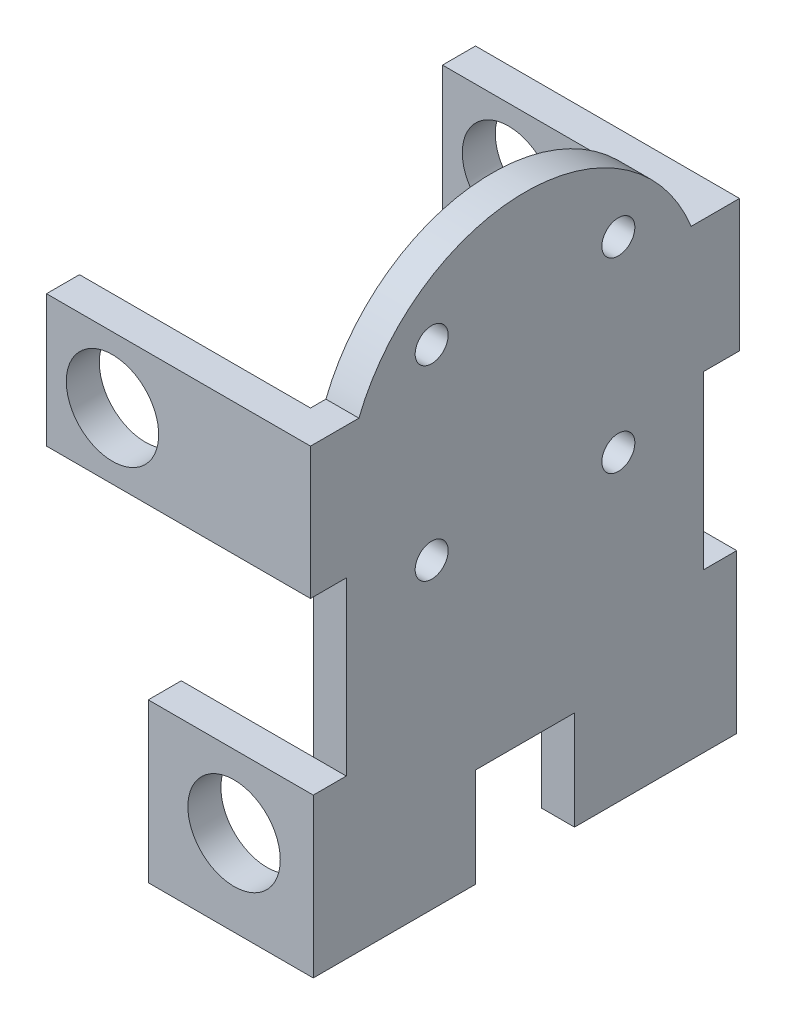
ISO-10303-21;
HEADER;
FILE_DESCRIPTION(('STEP AP214'),'2;1');
FILE_NAME('part.step','',(''),(''),'','','');
FILE_SCHEMA(('AUTOMOTIVE_DESIGN { 1 0 10303 214 1 1 1 1 }'));
ENDSEC;
DATA;
#1=APPLICATION_CONTEXT('core data for automotive mechanical design processes');
#2=APPLICATION_PROTOCOL_DEFINITION('international standard','automotive_design',2000,#1);
#3=PRODUCT_CONTEXT('',#1,'mechanical');
#4=PRODUCT('Part','Part','',(#3));
#5=PRODUCT_RELATED_PRODUCT_CATEGORY('part','',(#4));
#6=PRODUCT_DEFINITION_FORMATION('','',#4);
#7=PRODUCT_DEFINITION_CONTEXT('part definition',#1,'design');
#8=PRODUCT_DEFINITION('design','',#6,#7);
#9=PRODUCT_DEFINITION_SHAPE('','',#8);
#10=(LENGTH_UNIT() NAMED_UNIT(*) SI_UNIT(.MILLI.,.METRE.));
#11=(NAMED_UNIT(*) PLANE_ANGLE_UNIT() SI_UNIT($,.RADIAN.));
#12=(NAMED_UNIT(*) SI_UNIT($,.STERADIAN.) SOLID_ANGLE_UNIT());
#13=UNCERTAINTY_MEASURE_WITH_UNIT(LENGTH_MEASURE(1.E-05),#10,'distance_accuracy_value','');
#14=(GEOMETRIC_REPRESENTATION_CONTEXT(3) GLOBAL_UNCERTAINTY_ASSIGNED_CONTEXT((#13)) GLOBAL_UNIT_ASSIGNED_CONTEXT((#10,
#11,#12)) REPRESENTATION_CONTEXT('',''));
#15=CARTESIAN_POINT('',(0.,0.,0.));
#16=DIRECTION('',(0.,0.,1.));
#17=DIRECTION('',(1.,0.,0.));
#18=AXIS2_PLACEMENT_3D('',#15,#16,#17);
#19=CARTESIAN_POINT('',(-2.5,0.,27.08));
#20=DIRECTION('',(0.,0.,1.));
#21=DIRECTION('',(0.,-1.,0.));
#22=AXIS2_PLACEMENT_3D('',#19,#20,#21);
#23=PLANE('',#22);
#24=DIRECTION('',(0.,-1.,0.));
#25=VECTOR('',#24,1.);
#26=CARTESIAN_POINT('',(-2.5,0.,27.08));
#27=LINE('',#26,#25);
#28=CARTESIAN_POINT('',(-2.5,-10.,27.08));
#29=VERTEX_POINT('',#28);
#30=CARTESIAN_POINT('',(-2.5,-36.,27.08));
#31=VERTEX_POINT('',#30);
#32=EDGE_CURVE('E518',#29,#31,#27,.T.);
#33=ORIENTED_EDGE('',*,*,#32,.T.);
#34=DIRECTION('',(-1.,0.,0.));
#35=VECTOR('',#34,1.);
#36=CARTESIAN_POINT('',(2.5,-36.,27.08));
#37=LINE('',#36,#35);
#38=CARTESIAN_POINT('',(2.5,-36.,27.08));
#39=VERTEX_POINT('',#38);
#40=EDGE_CURVE('E298',#39,#31,#37,.T.);
#41=ORIENTED_EDGE('',*,*,#40,.F.);
#42=DIRECTION('',(0.,-1.,0.));
#43=VECTOR('',#42,1.);
#44=CARTESIAN_POINT('',(2.5,0.,27.08));
#45=LINE('',#44,#43);
#46=CARTESIAN_POINT('',(2.5,-10.,27.08));
#47=VERTEX_POINT('',#46);
#48=EDGE_CURVE('E235',#47,#39,#45,.T.);
#49=ORIENTED_EDGE('',*,*,#48,.F.);
#50=DIRECTION('',(1.,0.,0.));
#51=VECTOR('',#50,1.);
#52=CARTESIAN_POINT('',(-2.5,-10.,27.08));
#53=LINE('',#52,#51);
#54=EDGE_CURVE('E448',#29,#47,#53,.T.);
#55=ORIENTED_EDGE('',*,*,#54,.F.);
#56=EDGE_LOOP('',(#33,#41,#49,#55));
#57=FACE_BOUND('',#56,.T.);
#58=ADVANCED_FACE('F45',(#57),#23,.T.);
#59=CARTESIAN_POINT('',(-2.5,-60.,27.08));
#60=DIRECTION('',(0.,-1.,0.));
#61=DIRECTION('',(0.,0.,-1.));
#62=AXIS2_PLACEMENT_3D('',#59,#60,#61);
#63=PLANE('',#62);
#64=DIRECTION('',(-1.,0.,0.));
#65=VECTOR('',#64,1.);
#66=CARTESIAN_POINT('',(2.5,-60.,7.5));
#67=LINE('',#66,#65);
#68=CARTESIAN_POINT('',(2.5,-60.,7.5));
#69=VERTEX_POINT('',#68);
#70=CARTESIAN_POINT('',(-2.5,-60.,7.5));
#71=VERTEX_POINT('',#70);
#72=EDGE_CURVE('E343',#69,#71,#67,.T.);
#73=ORIENTED_EDGE('',*,*,#72,.F.);
#74=DIRECTION('',(0.,0.,-1.));
#75=VECTOR('',#74,1.);
#76=CARTESIAN_POINT('',(2.5,-60.,27.08));
#77=LINE('',#76,#75);
#78=CARTESIAN_POINT('',(2.5,-60.,32.08));
#79=VERTEX_POINT('',#78);
#80=EDGE_CURVE('E234',#79,#69,#77,.T.);
#81=ORIENTED_EDGE('',*,*,#80,.F.);
#82=DIRECTION('',(1.,0.,0.));
#83=VECTOR('',#82,1.);
#84=CARTESIAN_POINT('',(2.5,-60.,32.08));
#85=LINE('',#84,#83);
#86=CARTESIAN_POINT('',(-22.5,-60.,32.08));
#87=VERTEX_POINT('',#86);
#88=EDGE_CURVE('E293',#87,#79,#85,.T.);
#89=ORIENTED_EDGE('',*,*,#88,.F.);
#90=DIRECTION('',(0.,0.,-1.));
#91=VECTOR('',#90,1.);
#92=CARTESIAN_POINT('',(-22.5,-60.,32.08));
#93=LINE('',#92,#91);
#94=CARTESIAN_POINT('',(-22.5,-60.,27.08));
#95=VERTEX_POINT('',#94);
#96=EDGE_CURVE('E297',#87,#95,#93,.T.);
#97=ORIENTED_EDGE('',*,*,#96,.T.);
#98=DIRECTION('',(1.,0.,0.));
#99=VECTOR('',#98,1.);
#100=CARTESIAN_POINT('',(2.5,-60.,27.08));
#101=LINE('',#100,#99);
#102=CARTESIAN_POINT('',(-2.5,-60.,27.08));
#103=VERTEX_POINT('',#102);
#104=EDGE_CURVE('E287',#95,#103,#101,.T.);
#105=ORIENTED_EDGE('',*,*,#104,.T.);
#106=DIRECTION('',(0.,0.,-1.));
#107=VECTOR('',#106,1.);
#108=CARTESIAN_POINT('',(-2.5,-60.,27.08));
#109=LINE('',#108,#107);
#110=EDGE_CURVE('E523',#103,#71,#109,.T.);
#111=ORIENTED_EDGE('',*,*,#110,.T.);
#112=EDGE_LOOP('',(#73,#81,#89,#97,#105,#111));
#113=FACE_BOUND('',#112,.T.);
#114=ADVANCED_FACE('F551',(#113),#63,.T.);
#115=CARTESIAN_POINT('',(-2.5,0.,0.));
#116=DIRECTION('',(-1.,0.,0.));
#117=DIRECTION('',(0.,0.,1.));
#118=AXIS2_PLACEMENT_3D('',#115,#116,#117);
#119=PLANE('',#118);
#120=DIRECTION('',(0.,0.,-1.));
#121=VECTOR('',#120,1.);
#122=CARTESIAN_POINT('',(-2.5,-45.,7.5));
#123=LINE('',#122,#121);
#124=CARTESIAN_POINT('',(-2.5,-45.,7.5));
#125=VERTEX_POINT('',#124);
#126=CARTESIAN_POINT('',(-2.5,-45.,-7.5));
#127=VERTEX_POINT('',#126);
#128=EDGE_CURVE('E337',#125,#127,#123,.T.);
#129=ORIENTED_EDGE('',*,*,#128,.F.);
#130=DIRECTION('',(0.,1.,0.));
#131=VECTOR('',#130,1.);
#132=CARTESIAN_POINT('',(-2.5,-60.,7.5));
#133=LINE('',#132,#131);
#134=EDGE_CURVE('E323',#71,#125,#133,.T.);
#135=ORIENTED_EDGE('',*,*,#134,.F.);
#136=ORIENTED_EDGE('',*,*,#110,.F.);
#137=DIRECTION('',(0.,1.,0.));
#138=VECTOR('',#137,1.);
#139=CARTESIAN_POINT('',(-2.5,0.,27.08));
#140=LINE('',#139,#138);
#141=CARTESIAN_POINT('',(-2.5,-47.,27.08));
#142=VERTEX_POINT('',#141);
#143=EDGE_CURVE('E319',#103,#142,#140,.T.);
#144=ORIENTED_EDGE('',*,*,#143,.T.);
#145=EDGE_CURVE('E318',#142,#31,#140,.T.);
#146=ORIENTED_EDGE('',*,*,#145,.T.);
#147=ORIENTED_EDGE('',*,*,#32,.F.);
#148=DIRECTION('',(0.,0.,-1.));
#149=VECTOR('',#148,1.);
#150=CARTESIAN_POINT('',(-2.5,-10.,32.5));
#151=LINE('',#150,#149);
#152=CARTESIAN_POINT('',(-2.5,-10.,27.5));
#153=VERTEX_POINT('',#152);
#154=EDGE_CURVE('E436',#153,#29,#151,.T.);
#155=ORIENTED_EDGE('',*,*,#154,.F.);
#156=DIRECTION('',(0.,-1.,0.));
#157=VECTOR('',#156,1.);
#158=CARTESIAN_POINT('',(-2.5,10.,27.5));
#159=LINE('',#158,#157);
#160=CARTESIAN_POINT('',(-2.5,10.,27.5));
#161=VERTEX_POINT('',#160);
#162=EDGE_CURVE('E376',#161,#153,#159,.T.);
#163=ORIENTED_EDGE('',*,*,#162,.F.);
#164=DIRECTION('',(0.,0.,1.));
#165=VECTOR('',#164,1.);
#166=CARTESIAN_POINT('',(-2.5,10.,32.5));
#167=LINE('',#166,#165);
#168=CARTESIAN_POINT('',(-2.5,10.,25.1659770324937));
#169=VERTEX_POINT('',#168);
#170=EDGE_CURVE('E439',#169,#161,#167,.T.);
#171=ORIENTED_EDGE('',*,*,#170,.F.);
#172=CARTESIAN_POINT('',(-2.5,0.,0.));
#173=DIRECTION('',(1.,0.,0.));
#174=DIRECTION('',(0.,0.,1.));
#175=AXIS2_PLACEMENT_3D('',#172,#173,#174);
#176=CIRCLE('',#175,27.08);
#177=CARTESIAN_POINT('',(-2.5,10.,-25.1659770324937));
#178=VERTEX_POINT('',#177);
#179=EDGE_CURVE('E514',#178,#169,#176,.T.);
#180=ORIENTED_EDGE('',*,*,#179,.F.);
#181=CARTESIAN_POINT('',(-2.5,10.,-27.5));
#182=VERTEX_POINT('',#181);
#183=EDGE_CURVE('E440',#182,#178,#167,.T.);
#184=ORIENTED_EDGE('',*,*,#183,.F.);
#185=DIRECTION('',(0.,1.,0.));
#186=VECTOR('',#185,1.);
#187=CARTESIAN_POINT('',(-2.5,10.,-27.5));
#188=LINE('',#187,#186);
#189=CARTESIAN_POINT('',(-2.5,-10.,-27.5));
#190=VERTEX_POINT('',#189);
#191=EDGE_CURVE('E379',#190,#182,#188,.T.);
#192=ORIENTED_EDGE('',*,*,#191,.F.);
#193=CARTESIAN_POINT('',(-2.5,-10.,-27.08));
#194=VERTEX_POINT('',#193);
#195=EDGE_CURVE('E435',#194,#190,#151,.T.);
#196=ORIENTED_EDGE('',*,*,#195,.F.);
#197=DIRECTION('',(0.,1.,0.));
#198=VECTOR('',#197,1.);
#199=CARTESIAN_POINT('',(-2.5,0.,-27.08));
#200=LINE('',#199,#198);
#201=CARTESIAN_POINT('',(-2.5,-36.,-27.08));
#202=VERTEX_POINT('',#201);
#203=EDGE_CURVE('E57',#202,#194,#200,.T.);
#204=ORIENTED_EDGE('',*,*,#203,.F.);
#205=CARTESIAN_POINT('',(-2.5,-47.,-27.08));
#206=VERTEX_POINT('',#205);
#207=EDGE_CURVE('E55',#206,#202,#200,.T.);
#208=ORIENTED_EDGE('',*,*,#207,.F.);
#209=CARTESIAN_POINT('',(-2.5,-60.,-27.08));
#210=VERTEX_POINT('',#209);
#211=EDGE_CURVE('E11',#210,#206,#200,.T.);
#212=ORIENTED_EDGE('',*,*,#211,.F.);
#213=CARTESIAN_POINT('',(-2.5,-60.,-7.5));
#214=VERTEX_POINT('',#213);
#215=EDGE_CURVE('E522',#214,#210,#109,.T.);
#216=ORIENTED_EDGE('',*,*,#215,.F.);
#217=DIRECTION('',(0.,-1.,0.));
#218=VECTOR('',#217,1.);
#219=CARTESIAN_POINT('',(-2.5,-60.,-7.5));
#220=LINE('',#219,#218);
#221=EDGE_CURVE('E329',#127,#214,#220,.T.);
#222=ORIENTED_EDGE('',*,*,#221,.F.);
#223=EDGE_LOOP('',(#129,#135,#136,#144,#146,#147,#155,#163,#171,#180,#184,#192,#196,#204,#208,
#212,#216,#222));
#224=FACE_BOUND('',#223,.T.);
#225=CARTESIAN_POINT('',(-2.5,-14.1421356237308,14.1421356237311));
#226=DIRECTION('',(1.,0.,0.));
#227=DIRECTION('',(0.,0.,-1.));
#228=AXIS2_PLACEMENT_3D('',#225,#226,#227);
#229=CIRCLE('',#228,2.5);
#230=CARTESIAN_POINT('',(-2.5,-14.1421356237308,11.6421356237311));
#231=VERTEX_POINT('',#230);
#232=EDGE_CURVE('E471',#231,#231,#229,.T.);
#233=ORIENTED_EDGE('',*,*,#232,.T.);
#234=EDGE_LOOP('',(#233));
#235=FACE_BOUND('',#234,.T.);
#236=CARTESIAN_POINT('',(-2.5,-14.142135623731,-14.1421356237309));
#237=DIRECTION('',(1.,0.,0.));
#238=DIRECTION('',(0.,0.,-1.));
#239=AXIS2_PLACEMENT_3D('',#236,#237,#238);
#240=CIRCLE('',#239,2.5);
#241=CARTESIAN_POINT('',(-2.5,-14.142135623731,-16.6421356237309));
#242=VERTEX_POINT('',#241);
#243=EDGE_CURVE('E485',#242,#242,#240,.T.);
#244=ORIENTED_EDGE('',*,*,#243,.T.);
#245=EDGE_LOOP('',(#244));
#246=FACE_BOUND('',#245,.T.);
#247=CARTESIAN_POINT('',(-2.5,14.1421356237309,14.142135623731));
#248=DIRECTION('',(1.,0.,0.));
#249=DIRECTION('',(0.,0.,-1.));
#250=AXIS2_PLACEMENT_3D('',#247,#248,#249);
#251=CIRCLE('',#250,2.5);
#252=CARTESIAN_POINT('',(-2.5,14.1421356237309,11.642135623731));
#253=VERTEX_POINT('',#252);
#254=EDGE_CURVE('E496',#253,#253,#251,.T.);
#255=ORIENTED_EDGE('',*,*,#254,.T.);
#256=EDGE_LOOP('',(#255));
#257=FACE_BOUND('',#256,.T.);
#258=CARTESIAN_POINT('',(-2.5,14.1421356237309,-14.142135623731));
#259=DIRECTION('',(1.,0.,0.));
#260=DIRECTION('',(0.,0.,-1.));
#261=AXIS2_PLACEMENT_3D('',#258,#259,#260);
#262=CIRCLE('',#261,2.5);
#263=CARTESIAN_POINT('',(-2.5,14.1421356237309,-16.642135623731));
#264=VERTEX_POINT('',#263);
#265=EDGE_CURVE('E477',#264,#264,#262,.T.);
#266=ORIENTED_EDGE('',*,*,#265,.T.);
#267=EDGE_LOOP('',(#266));
#268=FACE_BOUND('',#267,.T.);
#269=ADVANCED_FACE('F556',(#224,#235,#246,#257,#268),#119,.T.);
#270=CARTESIAN_POINT('',(-2.5,0.,0.));
#271=DIRECTION('',(1.,0.,0.));
#272=DIRECTION('',(0.,0.,-1.));
#273=AXIS2_PLACEMENT_3D('',#270,#271,#272);
#274=CYLINDRICAL_SURFACE('',#273,27.08);
#275=DIRECTION('',(1.,0.,0.));
#276=VECTOR('',#275,1.);
#277=CARTESIAN_POINT('',(-2.5,10.,25.1659770324937));
#278=LINE('',#277,#276);
#279=CARTESIAN_POINT('',(2.5,10.,25.1659770324937));
#280=VERTEX_POINT('',#279);
#281=EDGE_CURVE('E468',#280,#169,#278,.F.);
#282=ORIENTED_EDGE('',*,*,#281,.F.);
#283=CARTESIAN_POINT('',(2.5,0.,0.));
#284=DIRECTION('',(1.,0.,0.));
#285=DIRECTION('',(0.,0.,1.));
#286=AXIS2_PLACEMENT_3D('',#283,#284,#285);
#287=CIRCLE('',#286,27.08);
#288=CARTESIAN_POINT('',(2.5,10.,-25.1659770324937));
#289=VERTEX_POINT('',#288);
#290=EDGE_CURVE('E500',#289,#280,#287,.T.);
#291=ORIENTED_EDGE('',*,*,#290,.F.);
#292=DIRECTION('',(1.,0.,0.));
#293=VECTOR('',#292,1.);
#294=CARTESIAN_POINT('',(-2.5,10.,-25.1659770324937));
#295=LINE('',#294,#293);
#296=EDGE_CURVE('E465',#178,#289,#295,.T.);
#297=ORIENTED_EDGE('',*,*,#296,.F.);
#298=ORIENTED_EDGE('',*,*,#179,.T.);
#299=EDGE_LOOP('',(#282,#291,#297,#298));
#300=FACE_BOUND('',#299,.T.);
#301=ADVANCED_FACE('F47',(#300),#274,.T.);
#302=CARTESIAN_POINT('',(-2.5,0.,-27.08));
#303=DIRECTION('',(0.,0.,-1.));
#304=DIRECTION('',(0.,1.,0.));
#305=AXIS2_PLACEMENT_3D('',#302,#303,#304);
#306=PLANE('',#305);
#307=DIRECTION('',(-1.,0.,0.));
#308=VECTOR('',#307,1.);
#309=CARTESIAN_POINT('',(2.5,-36.,-27.08));
#310=LINE('',#309,#308);
#311=CARTESIAN_POINT('',(2.5,-36.,-27.08));
#312=VERTEX_POINT('',#311);
#313=EDGE_CURVE('E246',#312,#202,#310,.T.);
#314=ORIENTED_EDGE('',*,*,#313,.T.);
#315=ORIENTED_EDGE('',*,*,#203,.T.);
#316=DIRECTION('',(-1.,0.,0.));
#317=VECTOR('',#316,1.);
#318=CARTESIAN_POINT('',(-2.5,-10.,-27.08));
#319=LINE('',#318,#317);
#320=CARTESIAN_POINT('',(2.5,-10.,-27.08));
#321=VERTEX_POINT('',#320);
#322=EDGE_CURVE('E461',#321,#194,#319,.T.);
#323=ORIENTED_EDGE('',*,*,#322,.F.);
#324=DIRECTION('',(0.,1.,0.));
#325=VECTOR('',#324,1.);
#326=CARTESIAN_POINT('',(2.5,0.,-27.08));
#327=LINE('',#326,#325);
#328=EDGE_CURVE('E511',#312,#321,#327,.T.);
#329=ORIENTED_EDGE('',*,*,#328,.F.);
#330=EDGE_LOOP('',(#314,#315,#323,#329));
#331=FACE_BOUND('',#330,.T.);
#332=ADVANCED_FACE('F561',(#331),#306,.T.);
#333=DIRECTION('',(-1.,0.,0.));
#334=VECTOR('',#333,1.);
#335=CARTESIAN_POINT('',(2.5,-60.,-7.5));
#336=LINE('',#335,#334);
#337=CARTESIAN_POINT('',(2.5,-60.,-7.5));
#338=VERTEX_POINT('',#337);
#339=EDGE_CURVE('E347',#338,#214,#336,.T.);
#340=ORIENTED_EDGE('',*,*,#339,.T.);
#341=ORIENTED_EDGE('',*,*,#215,.T.);
#342=DIRECTION('',(1.,0.,0.));
#343=VECTOR('',#342,1.);
#344=CARTESIAN_POINT('',(2.5,-60.,-27.08));
#345=LINE('',#344,#343);
#346=CARTESIAN_POINT('',(-22.5,-60.,-27.08));
#347=VERTEX_POINT('',#346);
#348=EDGE_CURVE('E261',#347,#210,#345,.T.);
#349=ORIENTED_EDGE('',*,*,#348,.F.);
#350=DIRECTION('',(0.,0.,1.));
#351=VECTOR('',#350,1.);
#352=CARTESIAN_POINT('',(-22.5,-60.,-32.08));
#353=LINE('',#352,#351);
#354=CARTESIAN_POINT('',(-22.5,-60.,-32.08));
#355=VERTEX_POINT('',#354);
#356=EDGE_CURVE('E250',#355,#347,#353,.T.);
#357=ORIENTED_EDGE('',*,*,#356,.F.);
#358=DIRECTION('',(1.,0.,0.));
#359=VECTOR('',#358,1.);
#360=CARTESIAN_POINT('',(2.5,-60.,-32.08));
#361=LINE('',#360,#359);
#362=CARTESIAN_POINT('',(2.5,-60.,-32.08));
#363=VERTEX_POINT('',#362);
#364=EDGE_CURVE('E241',#355,#363,#361,.T.);
#365=ORIENTED_EDGE('',*,*,#364,.T.);
#366=EDGE_CURVE('E220',#338,#363,#77,.T.);
#367=ORIENTED_EDGE('',*,*,#366,.F.);
#368=EDGE_LOOP('',(#340,#341,#349,#357,#365,#367));
#369=FACE_BOUND('',#368,.T.);
#370=ADVANCED_FACE('F248',(#369),#63,.T.);
#371=CARTESIAN_POINT('',(2.5,0.,0.));
#372=DIRECTION('',(-1.,0.,0.));
#373=DIRECTION('',(0.,0.,1.));
#374=AXIS2_PLACEMENT_3D('',#371,#372,#373);
#375=PLANE('',#374);
#376=ORIENTED_EDGE('',*,*,#80,.T.);
#377=DIRECTION('',(0.,1.,0.));
#378=VECTOR('',#377,1.);
#379=CARTESIAN_POINT('',(2.5,-60.,7.5));
#380=LINE('',#379,#378);
#381=CARTESIAN_POINT('',(2.5,-45.,7.5));
#382=VERTEX_POINT('',#381);
#383=EDGE_CURVE('E324',#69,#382,#380,.T.);
#384=ORIENTED_EDGE('',*,*,#383,.T.);
#385=DIRECTION('',(0.,0.,-1.));
#386=VECTOR('',#385,1.);
#387=CARTESIAN_POINT('',(2.5,-45.,7.5));
#388=LINE('',#387,#386);
#389=CARTESIAN_POINT('',(2.5,-45.,-7.5));
#390=VERTEX_POINT('',#389);
#391=EDGE_CURVE('E328',#382,#390,#388,.T.);
#392=ORIENTED_EDGE('',*,*,#391,.T.);
#393=DIRECTION('',(0.,-1.,0.));
#394=VECTOR('',#393,1.);
#395=CARTESIAN_POINT('',(2.5,-60.,-7.5));
#396=LINE('',#395,#394);
#397=EDGE_CURVE('E229',#390,#338,#396,.T.);
#398=ORIENTED_EDGE('',*,*,#397,.T.);
#399=ORIENTED_EDGE('',*,*,#366,.T.);
#400=DIRECTION('',(0.,1.,0.));
#401=VECTOR('',#400,1.);
#402=CARTESIAN_POINT('',(2.5,-60.,-32.08));
#403=LINE('',#402,#401);
#404=CARTESIAN_POINT('',(2.5,-36.,-32.08));
#405=VERTEX_POINT('',#404);
#406=EDGE_CURVE('E226',#363,#405,#403,.T.);
#407=ORIENTED_EDGE('',*,*,#406,.T.);
#408=DIRECTION('',(0.,0.,1.));
#409=VECTOR('',#408,1.);
#410=CARTESIAN_POINT('',(2.5,-36.,-32.08));
#411=LINE('',#410,#409);
#412=EDGE_CURVE('E260',#405,#312,#411,.T.);
#413=ORIENTED_EDGE('',*,*,#412,.T.);
#414=ORIENTED_EDGE('',*,*,#328,.T.);
#415=DIRECTION('',(0.,0.,-1.));
#416=VECTOR('',#415,1.);
#417=CARTESIAN_POINT('',(2.5,-10.,32.5));
#418=LINE('',#417,#416);
#419=CARTESIAN_POINT('',(2.5,-10.,-32.5));
#420=VERTEX_POINT('',#419);
#421=EDGE_CURVE('E422',#321,#420,#418,.T.);
#422=ORIENTED_EDGE('',*,*,#421,.T.);
#423=DIRECTION('',(0.,1.,0.));
#424=VECTOR('',#423,1.);
#425=CARTESIAN_POINT('',(2.5,10.,-32.5));
#426=LINE('',#425,#424);
#427=CARTESIAN_POINT('',(2.5,10.,-32.5));
#428=VERTEX_POINT('',#427);
#429=EDGE_CURVE('E426',#420,#428,#426,.T.);
#430=ORIENTED_EDGE('',*,*,#429,.T.);
#431=DIRECTION('',(0.,0.,1.));
#432=VECTOR('',#431,1.);
#433=CARTESIAN_POINT('',(2.5,10.,32.5));
#434=LINE('',#433,#432);
#435=EDGE_CURVE('E431',#428,#289,#434,.T.);
#436=ORIENTED_EDGE('',*,*,#435,.T.);
#437=ORIENTED_EDGE('',*,*,#290,.T.);
#438=CARTESIAN_POINT('',(2.5,10.,32.5));
#439=VERTEX_POINT('',#438);
#440=EDGE_CURVE('E430',#280,#439,#434,.T.);
#441=ORIENTED_EDGE('',*,*,#440,.T.);
#442=DIRECTION('',(0.,-1.,0.));
#443=VECTOR('',#442,1.);
#444=CARTESIAN_POINT('',(2.5,10.,32.5));
#445=LINE('',#444,#443);
#446=CARTESIAN_POINT('',(2.5,-10.,32.5));
#447=VERTEX_POINT('',#446);
#448=EDGE_CURVE('E418',#439,#447,#445,.T.);
#449=ORIENTED_EDGE('',*,*,#448,.T.);
#450=EDGE_CURVE('E423',#447,#47,#418,.T.);
#451=ORIENTED_EDGE('',*,*,#450,.T.);
#452=ORIENTED_EDGE('',*,*,#48,.T.);
#453=DIRECTION('',(0.,0.,-1.));
#454=VECTOR('',#453,1.);
#455=CARTESIAN_POINT('',(2.5,-36.,32.08));
#456=LINE('',#455,#454);
#457=CARTESIAN_POINT('',(2.5,-36.,32.08));
#458=VERTEX_POINT('',#457);
#459=EDGE_CURVE('E315',#458,#39,#456,.T.);
#460=ORIENTED_EDGE('',*,*,#459,.F.);
#461=DIRECTION('',(0.,1.,0.));
#462=VECTOR('',#461,1.);
#463=CARTESIAN_POINT('',(2.5,-60.,32.08));
#464=LINE('',#463,#462);
#465=EDGE_CURVE('E282',#79,#458,#464,.T.);
#466=ORIENTED_EDGE('',*,*,#465,.F.);
#467=EDGE_LOOP('',(#376,#384,#392,#398,#399,#407,#413,#414,#422,#430,#436,#437,#441,#449,#451,
#452,#460,#466));
#468=FACE_BOUND('',#467,.T.);
#469=CARTESIAN_POINT('',(2.5,-14.1421356237308,14.1421356237311));
#470=DIRECTION('',(1.,0.,0.));
#471=DIRECTION('',(0.,0.,-1.));
#472=AXIS2_PLACEMENT_3D('',#469,#470,#471);
#473=CIRCLE('',#472,2.5);
#474=CARTESIAN_POINT('',(2.5,-14.1421356237308,11.6421356237311));
#475=VERTEX_POINT('',#474);
#476=EDGE_CURVE('E489',#475,#475,#473,.T.);
#477=ORIENTED_EDGE('',*,*,#476,.F.);
#478=EDGE_LOOP('',(#477));
#479=FACE_BOUND('',#478,.T.);
#480=CARTESIAN_POINT('',(2.5,-14.142135623731,-14.1421356237309));
#481=DIRECTION('',(1.,0.,0.));
#482=DIRECTION('',(0.,0.,-1.));
#483=AXIS2_PLACEMENT_3D('',#480,#481,#482);
#484=CIRCLE('',#483,2.5);
#485=CARTESIAN_POINT('',(2.5,-14.142135623731,-16.6421356237309));
#486=VERTEX_POINT('',#485);
#487=EDGE_CURVE('E481',#486,#486,#484,.T.);
#488=ORIENTED_EDGE('',*,*,#487,.F.);
#489=EDGE_LOOP('',(#488));
#490=FACE_BOUND('',#489,.T.);
#491=CARTESIAN_POINT('',(2.5,14.1421356237309,14.142135623731));
#492=DIRECTION('',(1.,0.,0.));
#493=DIRECTION('',(0.,0.,-1.));
#494=AXIS2_PLACEMENT_3D('',#491,#492,#493);
#495=CIRCLE('',#494,2.5);
#496=CARTESIAN_POINT('',(2.5,14.1421356237309,11.642135623731));
#497=VERTEX_POINT('',#496);
#498=EDGE_CURVE('E476',#497,#497,#495,.T.);
#499=ORIENTED_EDGE('',*,*,#498,.F.);
#500=EDGE_LOOP('',(#499));
#501=FACE_BOUND('',#500,.T.);
#502=CARTESIAN_POINT('',(2.5,14.1421356237309,-14.142135623731));
#503=DIRECTION('',(1.,0.,0.));
#504=DIRECTION('',(0.,0.,-1.));
#505=AXIS2_PLACEMENT_3D('',#502,#503,#504);
#506=CIRCLE('',#505,2.5);
#507=CARTESIAN_POINT('',(2.5,14.1421356237309,-16.642135623731));
#508=VERTEX_POINT('',#507);
#509=EDGE_CURVE('E472',#508,#508,#506,.T.);
#510=ORIENTED_EDGE('',*,*,#509,.F.);
#511=EDGE_LOOP('',(#510));
#512=FACE_BOUND('',#511,.T.);
#513=ADVANCED_FACE('F223',(#468,#479,#490,#501,#512),#375,.F.);
#514=CARTESIAN_POINT('',(-2.5,14.1421356237309,14.142135623731));
#515=DIRECTION('',(1.,0.,0.));
#516=DIRECTION('',(0.,0.,-1.));
#517=AXIS2_PLACEMENT_3D('',#514,#515,#516);
#518=CYLINDRICAL_SURFACE('',#517,2.5);
#519=ORIENTED_EDGE('',*,*,#254,.F.);
#520=EDGE_LOOP('',(#519));
#521=FACE_BOUND('',#520,.T.);
#522=ORIENTED_EDGE('',*,*,#498,.T.);
#523=EDGE_LOOP('',(#522));
#524=FACE_BOUND('',#523,.T.);
#525=ADVANCED_FACE('F570',(#521,#524),#518,.F.);
#526=CARTESIAN_POINT('',(-2.5,14.1421356237309,-14.142135623731));
#527=DIRECTION('',(1.,0.,0.));
#528=DIRECTION('',(0.,0.,-1.));
#529=AXIS2_PLACEMENT_3D('',#526,#527,#528);
#530=CYLINDRICAL_SURFACE('',#529,2.5);
#531=ORIENTED_EDGE('',*,*,#265,.F.);
#532=EDGE_LOOP('',(#531));
#533=FACE_BOUND('',#532,.T.);
#534=ORIENTED_EDGE('',*,*,#509,.T.);
#535=EDGE_LOOP('',(#534));
#536=FACE_BOUND('',#535,.T.);
#537=ADVANCED_FACE('F573',(#533,#536),#530,.F.);
#538=CARTESIAN_POINT('',(-2.5,-14.142135623731,-14.1421356237309));
#539=DIRECTION('',(1.,0.,0.));
#540=DIRECTION('',(0.,0.,-1.));
#541=AXIS2_PLACEMENT_3D('',#538,#539,#540);
#542=CYLINDRICAL_SURFACE('',#541,2.5);
#543=ORIENTED_EDGE('',*,*,#243,.F.);
#544=EDGE_LOOP('',(#543));
#545=FACE_BOUND('',#544,.T.);
#546=ORIENTED_EDGE('',*,*,#487,.T.);
#547=EDGE_LOOP('',(#546));
#548=FACE_BOUND('',#547,.T.);
#549=ADVANCED_FACE('F579',(#545,#548),#542,.F.);
#550=CARTESIAN_POINT('',(-2.5,-14.1421356237308,14.1421356237311));
#551=DIRECTION('',(1.,0.,0.));
#552=DIRECTION('',(0.,0.,-1.));
#553=AXIS2_PLACEMENT_3D('',#550,#551,#552);
#554=CYLINDRICAL_SURFACE('',#553,2.5);
#555=ORIENTED_EDGE('',*,*,#232,.F.);
#556=EDGE_LOOP('',(#555));
#557=FACE_BOUND('',#556,.T.);
#558=ORIENTED_EDGE('',*,*,#476,.T.);
#559=EDGE_LOOP('',(#558));
#560=FACE_BOUND('',#559,.T.);
#561=ADVANCED_FACE('F575',(#557,#560),#554,.F.);
#562=CARTESIAN_POINT('',(-2.5,10.,32.5));
#563=DIRECTION('',(0.,0.,1.));
#564=DIRECTION('',(1.,0.,0.));
#565=AXIS2_PLACEMENT_3D('',#562,#563,#564);
#566=PLANE('',#565);
#567=CARTESIAN_POINT('',(-27.5,0.,32.5));
#568=DIRECTION('',(0.,0.,-1.));
#569=DIRECTION('',(-1.,0.,0.));
#570=AXIS2_PLACEMENT_3D('',#567,#568,#569);
#571=CIRCLE('',#570,7.00000000000001);
#572=CARTESIAN_POINT('',(-34.5,0.,32.5));
#573=VERTEX_POINT('',#572);
#574=EDGE_CURVE('E356',#573,#573,#571,.T.);
#575=ORIENTED_EDGE('',*,*,#574,.T.);
#576=EDGE_LOOP('',(#575));
#577=FACE_BOUND('',#576,.T.);
#578=DIRECTION('',(1.,0.,0.));
#579=VECTOR('',#578,1.);
#580=CARTESIAN_POINT('',(-2.5,-10.,32.5));
#581=LINE('',#580,#579);
#582=CARTESIAN_POINT('',(-37.5,-10.,32.5));
#583=VERTEX_POINT('',#582);
#584=EDGE_CURVE('E443',#583,#447,#581,.T.);
#585=ORIENTED_EDGE('',*,*,#584,.T.);
#586=ORIENTED_EDGE('',*,*,#448,.F.);
#587=DIRECTION('',(1.,0.,0.));
#588=VECTOR('',#587,1.);
#589=CARTESIAN_POINT('',(-2.5,10.,32.5));
#590=LINE('',#589,#588);
#591=CARTESIAN_POINT('',(-37.5,10.,32.5));
#592=VERTEX_POINT('',#591);
#593=EDGE_CURVE('E444',#592,#439,#590,.T.);
#594=ORIENTED_EDGE('',*,*,#593,.F.);
#595=DIRECTION('',(0.,1.,0.));
#596=VECTOR('',#595,1.);
#597=CARTESIAN_POINT('',(-37.5,10.,32.5));
#598=LINE('',#597,#596);
#599=EDGE_CURVE('E380',#583,#592,#598,.T.);
#600=ORIENTED_EDGE('',*,*,#599,.F.);
#601=EDGE_LOOP('',(#585,#586,#594,#600));
#602=FACE_BOUND('',#601,.T.);
#603=ADVANCED_FACE('F578',(#577,#602),#566,.T.);
#604=CARTESIAN_POINT('',(-2.5,-10.,32.5));
#605=DIRECTION('',(0.,-1.,0.));
#606=DIRECTION('',(0.,0.,-1.));
#607=AXIS2_PLACEMENT_3D('',#604,#605,#606);
#608=PLANE('',#607);
#609=ORIENTED_EDGE('',*,*,#584,.F.);
#610=DIRECTION('',(0.,0.,1.));
#611=VECTOR('',#610,1.);
#612=CARTESIAN_POINT('',(-37.5,-10.,32.5));
#613=LINE('',#612,#611);
#614=CARTESIAN_POINT('',(-37.5,-10.,27.5));
#615=VERTEX_POINT('',#614);
#616=EDGE_CURVE('E375',#615,#583,#613,.T.);
#617=ORIENTED_EDGE('',*,*,#616,.F.);
#618=DIRECTION('',(1.,0.,0.));
#619=VECTOR('',#618,1.);
#620=CARTESIAN_POINT('',(-37.5,-10.,27.5));
#621=LINE('',#620,#619);
#622=EDGE_CURVE('E371',#615,#153,#621,.T.);
#623=ORIENTED_EDGE('',*,*,#622,.T.);
#624=ORIENTED_EDGE('',*,*,#154,.T.);
#625=ORIENTED_EDGE('',*,*,#54,.T.);
#626=ORIENTED_EDGE('',*,*,#450,.F.);
#627=EDGE_LOOP('',(#609,#617,#623,#624,#625,#626));
#628=FACE_BOUND('',#627,.T.);
#629=ADVANCED_FACE('F589',(#628),#608,.T.);
#630=CARTESIAN_POINT('',(-2.5,10.,32.5));
#631=DIRECTION('',(0.,1.,0.));
#632=DIRECTION('',(0.,0.,1.));
#633=AXIS2_PLACEMENT_3D('',#630,#631,#632);
#634=PLANE('',#633);
#635=ORIENTED_EDGE('',*,*,#440,.F.);
#636=ORIENTED_EDGE('',*,*,#281,.T.);
#637=ORIENTED_EDGE('',*,*,#170,.T.);
#638=DIRECTION('',(1.,0.,0.));
#639=VECTOR('',#638,1.);
#640=CARTESIAN_POINT('',(-37.5,10.,27.5));
#641=LINE('',#640,#639);
#642=CARTESIAN_POINT('',(-37.5,10.,27.5));
#643=VERTEX_POINT('',#642);
#644=EDGE_CURVE('E368',#643,#161,#641,.T.);
#645=ORIENTED_EDGE('',*,*,#644,.F.);
#646=DIRECTION('',(0.,0.,-1.));
#647=VECTOR('',#646,1.);
#648=CARTESIAN_POINT('',(-37.5,10.,32.5));
#649=LINE('',#648,#647);
#650=EDGE_CURVE('E387',#592,#643,#649,.T.);
#651=ORIENTED_EDGE('',*,*,#650,.F.);
#652=ORIENTED_EDGE('',*,*,#593,.T.);
#653=EDGE_LOOP('',(#635,#636,#637,#645,#651,#652));
#654=FACE_BOUND('',#653,.T.);
#655=ADVANCED_FACE('F593',(#654),#634,.T.);
#656=ORIENTED_EDGE('',*,*,#421,.F.);
#657=ORIENTED_EDGE('',*,*,#322,.T.);
#658=ORIENTED_EDGE('',*,*,#195,.T.);
#659=DIRECTION('',(1.,0.,0.));
#660=VECTOR('',#659,1.);
#661=CARTESIAN_POINT('',(-37.5,-10.,-27.5));
#662=LINE('',#661,#660);
#663=CARTESIAN_POINT('',(-37.5,-10.,-27.5));
#664=VERTEX_POINT('',#663);
#665=EDGE_CURVE('E414',#664,#190,#662,.T.);
#666=ORIENTED_EDGE('',*,*,#665,.F.);
#667=DIRECTION('',(0.,0.,1.));
#668=VECTOR('',#667,1.);
#669=CARTESIAN_POINT('',(-37.5,-10.,-32.5));
#670=LINE('',#669,#668);
#671=CARTESIAN_POINT('',(-37.5,-10.,-32.5));
#672=VERTEX_POINT('',#671);
#673=EDGE_CURVE('E397',#672,#664,#670,.T.);
#674=ORIENTED_EDGE('',*,*,#673,.F.);
#675=DIRECTION('',(1.,0.,0.));
#676=VECTOR('',#675,1.);
#677=CARTESIAN_POINT('',(-2.5,-10.,-32.5));
#678=LINE('',#677,#676);
#679=EDGE_CURVE('E452',#672,#420,#678,.T.);
#680=ORIENTED_EDGE('',*,*,#679,.T.);
#681=EDGE_LOOP('',(#656,#657,#658,#666,#674,#680));
#682=FACE_BOUND('',#681,.T.);
#683=ADVANCED_FACE('F595',(#682),#608,.T.);
#684=DIRECTION('',(1.,0.,0.));
#685=VECTOR('',#684,1.);
#686=CARTESIAN_POINT('',(-2.5,10.,-32.5));
#687=LINE('',#686,#685);
#688=CARTESIAN_POINT('',(-37.5,10.,-32.5));
#689=VERTEX_POINT('',#688);
#690=EDGE_CURVE('E449',#689,#428,#687,.T.);
#691=ORIENTED_EDGE('',*,*,#690,.F.);
#692=DIRECTION('',(0.,0.,-1.));
#693=VECTOR('',#692,1.);
#694=CARTESIAN_POINT('',(-37.5,10.,-32.5));
#695=LINE('',#694,#693);
#696=CARTESIAN_POINT('',(-37.5,10.,-27.5));
#697=VERTEX_POINT('',#696);
#698=EDGE_CURVE('E403',#697,#689,#695,.T.);
#699=ORIENTED_EDGE('',*,*,#698,.F.);
#700=DIRECTION('',(1.,0.,0.));
#701=VECTOR('',#700,1.);
#702=CARTESIAN_POINT('',(-37.5,10.,-27.5));
#703=LINE('',#702,#701);
#704=EDGE_CURVE('E407',#697,#182,#703,.T.);
#705=ORIENTED_EDGE('',*,*,#704,.T.);
#706=ORIENTED_EDGE('',*,*,#183,.T.);
#707=ORIENTED_EDGE('',*,*,#296,.T.);
#708=ORIENTED_EDGE('',*,*,#435,.F.);
#709=EDGE_LOOP('',(#691,#699,#705,#706,#707,#708));
#710=FACE_BOUND('',#709,.T.);
#711=ADVANCED_FACE('F600',(#710),#634,.T.);
#712=CARTESIAN_POINT('',(-2.5,10.,-32.5));
#713=DIRECTION('',(0.,0.,-1.));
#714=DIRECTION('',(-1.,0.,0.));
#715=AXIS2_PLACEMENT_3D('',#712,#713,#714);
#716=PLANE('',#715);
#717=CARTESIAN_POINT('',(-27.5,0.,-32.5));
#718=DIRECTION('',(0.,0.,-1.));
#719=DIRECTION('',(-1.,0.,0.));
#720=AXIS2_PLACEMENT_3D('',#717,#718,#719);
#721=CIRCLE('',#720,7.00000000000001);
#722=CARTESIAN_POINT('',(-34.5,0.,-32.5));
#723=VERTEX_POINT('',#722);
#724=EDGE_CURVE('E346',#723,#723,#721,.T.);
#725=ORIENTED_EDGE('',*,*,#724,.F.);
#726=EDGE_LOOP('',(#725));
#727=FACE_BOUND('',#726,.T.);
#728=ORIENTED_EDGE('',*,*,#690,.T.);
#729=ORIENTED_EDGE('',*,*,#429,.F.);
#730=ORIENTED_EDGE('',*,*,#679,.F.);
#731=DIRECTION('',(0.,-1.,0.));
#732=VECTOR('',#731,1.);
#733=CARTESIAN_POINT('',(-37.5,10.,-32.5));
#734=LINE('',#733,#732);
#735=EDGE_CURVE('E393',#689,#672,#734,.T.);
#736=ORIENTED_EDGE('',*,*,#735,.F.);
#737=EDGE_LOOP('',(#728,#729,#730,#736));
#738=FACE_BOUND('',#737,.T.);
#739=ADVANCED_FACE('F596',(#727,#738),#716,.T.);
#740=CARTESIAN_POINT('',(-37.5,10.,-27.5));
#741=DIRECTION('',(0.,0.,-1.));
#742=DIRECTION('',(0.,1.,0.));
#743=AXIS2_PLACEMENT_3D('',#740,#741,#742);
#744=PLANE('',#743);
#745=CARTESIAN_POINT('',(-27.5,0.,-27.5));
#746=DIRECTION('',(0.,0.,-1.));
#747=DIRECTION('',(0.,1.,0.));
#748=AXIS2_PLACEMENT_3D('',#745,#746,#747);
#749=CIRCLE('',#748,7.00000000000001);
#750=CARTESIAN_POINT('',(-27.5,7.00000000000001,-27.5));
#751=VERTEX_POINT('',#750);
#752=EDGE_CURVE('E364',#751,#751,#749,.T.);
#753=ORIENTED_EDGE('',*,*,#752,.T.);
#754=EDGE_LOOP('',(#753));
#755=FACE_BOUND('',#754,.T.);
#756=ORIENTED_EDGE('',*,*,#191,.T.);
#757=ORIENTED_EDGE('',*,*,#704,.F.);
#758=DIRECTION('',(0.,1.,0.));
#759=VECTOR('',#758,1.);
#760=CARTESIAN_POINT('',(-37.5,10.,-27.5));
#761=LINE('',#760,#759);
#762=EDGE_CURVE('E400',#664,#697,#761,.T.);
#763=ORIENTED_EDGE('',*,*,#762,.F.);
#764=ORIENTED_EDGE('',*,*,#665,.T.);
#765=EDGE_LOOP('',(#756,#757,#763,#764));
#766=FACE_BOUND('',#765,.T.);
#767=ADVANCED_FACE('F599',(#755,#766),#744,.F.);
#768=CARTESIAN_POINT('',(-37.5,0.,0.));
#769=DIRECTION('',(-1.,0.,0.));
#770=DIRECTION('',(0.,0.,1.));
#771=AXIS2_PLACEMENT_3D('',#768,#769,#770);
#772=PLANE('',#771);
#773=ORIENTED_EDGE('',*,*,#735,.T.);
#774=ORIENTED_EDGE('',*,*,#673,.T.);
#775=ORIENTED_EDGE('',*,*,#762,.T.);
#776=ORIENTED_EDGE('',*,*,#698,.T.);
#777=EDGE_LOOP('',(#773,#774,#775,#776));
#778=FACE_BOUND('',#777,.T.);
#779=ADVANCED_FACE('F607',(#778),#772,.T.);
#780=CARTESIAN_POINT('',(-37.5,10.,27.5));
#781=DIRECTION('',(0.,0.,1.));
#782=DIRECTION('',(0.,-1.,0.));
#783=AXIS2_PLACEMENT_3D('',#780,#781,#782);
#784=PLANE('',#783);
#785=CARTESIAN_POINT('',(-27.5,0.,27.5));
#786=DIRECTION('',(0.,0.,1.));
#787=DIRECTION('',(0.,-1.,0.));
#788=AXIS2_PLACEMENT_3D('',#785,#786,#787);
#789=CIRCLE('',#788,7.00000000000001);
#790=CARTESIAN_POINT('',(-27.5,-7.00000000000001,27.5));
#791=VERTEX_POINT('',#790);
#792=EDGE_CURVE('E360',#791,#791,#789,.T.);
#793=ORIENTED_EDGE('',*,*,#792,.T.);
#794=EDGE_LOOP('',(#793));
#795=FACE_BOUND('',#794,.T.);
#796=ORIENTED_EDGE('',*,*,#162,.T.);
#797=ORIENTED_EDGE('',*,*,#622,.F.);
#798=DIRECTION('',(0.,-1.,0.));
#799=VECTOR('',#798,1.);
#800=CARTESIAN_POINT('',(-37.5,10.,27.5));
#801=LINE('',#800,#799);
#802=EDGE_CURVE('E384',#643,#615,#801,.T.);
#803=ORIENTED_EDGE('',*,*,#802,.F.);
#804=ORIENTED_EDGE('',*,*,#644,.T.);
#805=EDGE_LOOP('',(#796,#797,#803,#804));
#806=FACE_BOUND('',#805,.T.);
#807=ADVANCED_FACE('F530',(#795,#806),#784,.F.);
#808=CARTESIAN_POINT('',(-37.5,0.,0.));
#809=DIRECTION('',(1.,0.,0.));
#810=DIRECTION('',(0.,0.,-1.));
#811=AXIS2_PLACEMENT_3D('',#808,#809,#810);
#812=PLANE('',#811);
#813=ORIENTED_EDGE('',*,*,#599,.T.);
#814=ORIENTED_EDGE('',*,*,#650,.T.);
#815=ORIENTED_EDGE('',*,*,#802,.T.);
#816=ORIENTED_EDGE('',*,*,#616,.T.);
#817=EDGE_LOOP('',(#813,#814,#815,#816));
#818=FACE_BOUND('',#817,.T.);
#819=ADVANCED_FACE('F536',(#818),#812,.F.);
#820=CARTESIAN_POINT('',(-27.5,0.,32.5));
#821=DIRECTION('',(0.,0.,-1.));
#822=DIRECTION('',(-1.,0.,0.));
#823=AXIS2_PLACEMENT_3D('',#820,#821,#822);
#824=CYLINDRICAL_SURFACE('',#823,7.00000000000001);
#825=ORIENTED_EDGE('',*,*,#574,.F.);
#826=EDGE_LOOP('',(#825));
#827=FACE_BOUND('',#826,.T.);
#828=ORIENTED_EDGE('',*,*,#792,.F.);
#829=EDGE_LOOP('',(#828));
#830=FACE_BOUND('',#829,.T.);
#831=ADVANCED_FACE('F533',(#827,#830),#824,.F.);
#832=ORIENTED_EDGE('',*,*,#724,.T.);
#833=EDGE_LOOP('',(#832));
#834=FACE_BOUND('',#833,.T.);
#835=ORIENTED_EDGE('',*,*,#752,.F.);
#836=EDGE_LOOP('',(#835));
#837=FACE_BOUND('',#836,.T.);
#838=ADVANCED_FACE('F535',(#834,#837),#824,.F.);
#839=CARTESIAN_POINT('',(2.5,-60.,7.5));
#840=DIRECTION('',(0.,0.,1.));
#841=DIRECTION('',(1.,0.,0.));
#842=AXIS2_PLACEMENT_3D('',#839,#840,#841);
#843=PLANE('',#842);
#844=ORIENTED_EDGE('',*,*,#134,.T.);
#845=DIRECTION('',(-1.,0.,0.));
#846=VECTOR('',#845,1.);
#847=CARTESIAN_POINT('',(2.5,-45.,7.5));
#848=LINE('',#847,#846);
#849=EDGE_CURVE('E334',#382,#125,#848,.T.);
#850=ORIENTED_EDGE('',*,*,#849,.F.);
#851=ORIENTED_EDGE('',*,*,#383,.F.);
#852=ORIENTED_EDGE('',*,*,#72,.T.);
#853=EDGE_LOOP('',(#844,#850,#851,#852));
#854=FACE_BOUND('',#853,.T.);
#855=ADVANCED_FACE('F543',(#854),#843,.F.);
#856=CARTESIAN_POINT('',(2.5,-60.,-7.5));
#857=DIRECTION('',(0.,0.,-1.));
#858=DIRECTION('',(0.,1.,0.));
#859=AXIS2_PLACEMENT_3D('',#856,#857,#858);
#860=PLANE('',#859);
#861=ORIENTED_EDGE('',*,*,#221,.T.);
#862=ORIENTED_EDGE('',*,*,#339,.F.);
#863=ORIENTED_EDGE('',*,*,#397,.F.);
#864=DIRECTION('',(-1.,0.,0.));
#865=VECTOR('',#864,1.);
#866=CARTESIAN_POINT('',(2.5,-45.,-7.5));
#867=LINE('',#866,#865);
#868=EDGE_CURVE('E350',#390,#127,#867,.T.);
#869=ORIENTED_EDGE('',*,*,#868,.T.);
#870=EDGE_LOOP('',(#861,#862,#863,#869));
#871=FACE_BOUND('',#870,.T.);
#872=ADVANCED_FACE('F642',(#871),#860,.F.);
#873=CARTESIAN_POINT('',(2.5,-45.,7.5));
#874=DIRECTION('',(0.,1.,0.));
#875=DIRECTION('',(0.,0.,1.));
#876=AXIS2_PLACEMENT_3D('',#873,#874,#875);
#877=PLANE('',#876);
#878=ORIENTED_EDGE('',*,*,#128,.T.);
#879=ORIENTED_EDGE('',*,*,#868,.F.);
#880=ORIENTED_EDGE('',*,*,#391,.F.);
#881=ORIENTED_EDGE('',*,*,#849,.T.);
#882=EDGE_LOOP('',(#878,#879,#880,#881));
#883=FACE_BOUND('',#882,.T.);
#884=ADVANCED_FACE('F652',(#883),#877,.F.);
#885=CARTESIAN_POINT('',(2.5,-36.,32.08));
#886=DIRECTION('',(0.,-1.,0.));
#887=DIRECTION('',(0.,0.,-1.));
#888=AXIS2_PLACEMENT_3D('',#885,#886,#887);
#889=PLANE('',#888);
#890=ORIENTED_EDGE('',*,*,#40,.T.);
#891=CARTESIAN_POINT('',(-22.5,-36.,27.08));
#892=VERTEX_POINT('',#891);
#893=EDGE_CURVE('E281',#31,#892,#37,.T.);
#894=ORIENTED_EDGE('',*,*,#893,.T.);
#895=DIRECTION('',(0.,0.,-1.));
#896=VECTOR('',#895,1.);
#897=CARTESIAN_POINT('',(-22.5,-36.,32.08));
#898=LINE('',#897,#896);
#899=CARTESIAN_POINT('',(-22.5,-36.,32.08));
#900=VERTEX_POINT('',#899);
#901=EDGE_CURVE('E311',#900,#892,#898,.T.);
#902=ORIENTED_EDGE('',*,*,#901,.F.);
#903=DIRECTION('',(-1.,0.,0.));
#904=VECTOR('',#903,1.);
#905=CARTESIAN_POINT('',(2.5,-36.,32.08));
#906=LINE('',#905,#904);
#907=EDGE_CURVE('E286',#458,#900,#906,.T.);
#908=ORIENTED_EDGE('',*,*,#907,.F.);
#909=ORIENTED_EDGE('',*,*,#459,.T.);
#910=EDGE_LOOP('',(#890,#894,#902,#908,#909));
#911=FACE_BOUND('',#910,.T.);
#912=ADVANCED_FACE('F662',(#911),#889,.F.);
#913=CARTESIAN_POINT('',(-22.5,-60.,32.08));
#914=DIRECTION('',(1.,0.,0.));
#915=DIRECTION('',(0.,0.,-1.));
#916=AXIS2_PLACEMENT_3D('',#913,#914,#915);
#917=PLANE('',#916);
#918=DIRECTION('',(0.,-1.,0.));
#919=VECTOR('',#918,1.);
#920=CARTESIAN_POINT('',(-22.5,-60.,27.08));
#921=LINE('',#920,#919);
#922=EDGE_CURVE('E302',#892,#95,#921,.T.);
#923=ORIENTED_EDGE('',*,*,#922,.T.);
#924=ORIENTED_EDGE('',*,*,#96,.F.);
#925=DIRECTION('',(0.,-1.,0.));
#926=VECTOR('',#925,1.);
#927=CARTESIAN_POINT('',(-22.5,-60.,32.08));
#928=LINE('',#927,#926);
#929=EDGE_CURVE('E290',#900,#87,#928,.T.);
#930=ORIENTED_EDGE('',*,*,#929,.F.);
#931=ORIENTED_EDGE('',*,*,#901,.T.);
#932=EDGE_LOOP('',(#923,#924,#930,#931));
#933=FACE_BOUND('',#932,.T.);
#934=ADVANCED_FACE('F673',(#933),#917,.F.);
#935=CARTESIAN_POINT('',(0.,0.,32.08));
#936=DIRECTION('',(0.,0.,1.));
#937=DIRECTION('',(1.,0.,0.));
#938=AXIS2_PLACEMENT_3D('',#935,#936,#937);
#939=PLANE('',#938);
#940=CARTESIAN_POINT('',(-9.5,-47.,32.08));
#941=DIRECTION('',(0.,0.,1.));
#942=DIRECTION('',(1.,0.,0.));
#943=AXIS2_PLACEMENT_3D('',#940,#941,#942);
#944=CIRCLE('',#943,7.);
#945=CARTESIAN_POINT('',(-2.5,-47.,32.08));
#946=VERTEX_POINT('',#945);
#947=EDGE_CURVE('E265',#946,#946,#944,.T.);
#948=ORIENTED_EDGE('',*,*,#947,.F.);
#949=EDGE_LOOP('',(#948));
#950=FACE_BOUND('',#949,.T.);
#951=ORIENTED_EDGE('',*,*,#465,.T.);
#952=ORIENTED_EDGE('',*,*,#907,.T.);
#953=ORIENTED_EDGE('',*,*,#929,.T.);
#954=ORIENTED_EDGE('',*,*,#88,.T.);
#955=EDGE_LOOP('',(#951,#952,#953,#954));
#956=FACE_BOUND('',#955,.T.);
#957=ADVANCED_FACE('F684',(#950,#956),#939,.T.);
#958=CARTESIAN_POINT('',(0.,0.,27.08));
#959=DIRECTION('',(0.,0.,1.));
#960=DIRECTION('',(1.,0.,0.));
#961=AXIS2_PLACEMENT_3D('',#958,#959,#960);
#962=PLANE('',#961);
#963=ORIENTED_EDGE('',*,*,#145,.F.);
#964=CARTESIAN_POINT('',(-9.5,-47.,27.08));
#965=DIRECTION('',(0.,0.,1.));
#966=DIRECTION('',(1.,0.,0.));
#967=AXIS2_PLACEMENT_3D('',#964,#965,#966);
#968=CIRCLE('',#967,7.);
#969=EDGE_CURVE('E62',#142,#142,#968,.T.);
#970=ORIENTED_EDGE('',*,*,#969,.T.);
#971=ORIENTED_EDGE('',*,*,#143,.F.);
#972=ORIENTED_EDGE('',*,*,#104,.F.);
#973=ORIENTED_EDGE('',*,*,#922,.F.);
#974=ORIENTED_EDGE('',*,*,#893,.F.);
#975=EDGE_LOOP('',(#963,#970,#971,#972,#973,#974));
#976=FACE_BOUND('',#975,.T.);
#977=ADVANCED_FACE('F694',(#976),#962,.F.);
#978=CARTESIAN_POINT('',(-22.5,-60.,-32.08));
#979=DIRECTION('',(-1.,0.,0.));
#980=DIRECTION('',(0.,0.,1.));
#981=AXIS2_PLACEMENT_3D('',#978,#979,#980);
#982=PLANE('',#981);
#983=DIRECTION('',(0.,-1.,0.));
#984=VECTOR('',#983,1.);
#985=CARTESIAN_POINT('',(-22.5,-60.,-27.08));
#986=LINE('',#985,#984);
#987=CARTESIAN_POINT('',(-22.5,-36.,-27.08));
#988=VERTEX_POINT('',#987);
#989=EDGE_CURVE('E264',#988,#347,#986,.T.);
#990=ORIENTED_EDGE('',*,*,#989,.F.);
#991=DIRECTION('',(0.,0.,1.));
#992=VECTOR('',#991,1.);
#993=CARTESIAN_POINT('',(-22.5,-36.,-32.08));
#994=LINE('',#993,#992);
#995=CARTESIAN_POINT('',(-22.5,-36.,-32.08));
#996=VERTEX_POINT('',#995);
#997=EDGE_CURVE('E275',#996,#988,#994,.T.);
#998=ORIENTED_EDGE('',*,*,#997,.F.);
#999=DIRECTION('',(0.,-1.,0.));
#1000=VECTOR('',#999,1.);
#1001=CARTESIAN_POINT('',(-22.5,-60.,-32.08));
#1002=LINE('',#1001,#1000);
#1003=EDGE_CURVE('E252',#996,#355,#1002,.T.);
#1004=ORIENTED_EDGE('',*,*,#1003,.T.);
#1005=ORIENTED_EDGE('',*,*,#356,.T.);
#1006=EDGE_LOOP('',(#990,#998,#1004,#1005));
#1007=FACE_BOUND('',#1006,.T.);
#1008=ADVANCED_FACE('F704',(#1007),#982,.T.);
#1009=CARTESIAN_POINT('',(2.5,-36.,-32.08));
#1010=DIRECTION('',(0.,1.,0.));
#1011=DIRECTION('',(0.,0.,1.));
#1012=AXIS2_PLACEMENT_3D('',#1009,#1010,#1011);
#1013=PLANE('',#1012);
#1014=ORIENTED_EDGE('',*,*,#313,.F.);
#1015=ORIENTED_EDGE('',*,*,#412,.F.);
#1016=DIRECTION('',(-1.,0.,0.));
#1017=VECTOR('',#1016,1.);
#1018=CARTESIAN_POINT('',(2.5,-36.,-32.08));
#1019=LINE('',#1018,#1017);
#1020=EDGE_CURVE('E244',#405,#996,#1019,.T.);
#1021=ORIENTED_EDGE('',*,*,#1020,.T.);
#1022=ORIENTED_EDGE('',*,*,#997,.T.);
#1023=EDGE_CURVE('E269',#202,#988,#310,.T.);
#1024=ORIENTED_EDGE('',*,*,#1023,.F.);
#1025=EDGE_LOOP('',(#1014,#1015,#1021,#1022,#1024));
#1026=FACE_BOUND('',#1025,.T.);
#1027=ADVANCED_FACE('F715',(#1026),#1013,.T.);
#1028=CARTESIAN_POINT('',(0.,0.,-32.08));
#1029=DIRECTION('',(0.,0.,-1.));
#1030=DIRECTION('',(1.,0.,0.));
#1031=AXIS2_PLACEMENT_3D('',#1028,#1029,#1030);
#1032=PLANE('',#1031);
#1033=CARTESIAN_POINT('',(-9.5,-47.,-32.08));
#1034=DIRECTION('',(0.,0.,-1.));
#1035=DIRECTION('',(-1.,0.,0.));
#1036=AXIS2_PLACEMENT_3D('',#1033,#1034,#1035);
#1037=CIRCLE('',#1036,7.);
#1038=CARTESIAN_POINT('',(-16.5,-47.,-32.08));
#1039=VERTEX_POINT('',#1038);
#1040=EDGE_CURVE('E1096',#1039,#1039,#1037,.T.);
#1041=ORIENTED_EDGE('',*,*,#1040,.F.);
#1042=EDGE_LOOP('',(#1041));
#1043=FACE_BOUND('',#1042,.T.);
#1044=ORIENTED_EDGE('',*,*,#406,.F.);
#1045=ORIENTED_EDGE('',*,*,#364,.F.);
#1046=ORIENTED_EDGE('',*,*,#1003,.F.);
#1047=ORIENTED_EDGE('',*,*,#1020,.F.);
#1048=EDGE_LOOP('',(#1044,#1045,#1046,#1047));
#1049=FACE_BOUND('',#1048,.T.);
#1050=ADVANCED_FACE('F239',(#1043,#1049),#1032,.T.);
#1051=CARTESIAN_POINT('',(0.,0.,-27.08));
#1052=DIRECTION('',(0.,0.,-1.));
#1053=DIRECTION('',(1.,0.,0.));
#1054=AXIS2_PLACEMENT_3D('',#1051,#1052,#1053);
#1055=PLANE('',#1054);
#1056=ORIENTED_EDGE('',*,*,#211,.T.);
#1057=CARTESIAN_POINT('',(-9.5,-47.,-27.08));
#1058=DIRECTION('',(0.,0.,-1.));
#1059=DIRECTION('',(-1.,0.,0.));
#1060=AXIS2_PLACEMENT_3D('',#1057,#1058,#1059);
#1061=CIRCLE('',#1060,7.);
#1062=EDGE_CURVE('E49',#206,#206,#1061,.T.);
#1063=ORIENTED_EDGE('',*,*,#1062,.T.);
#1064=ORIENTED_EDGE('',*,*,#207,.T.);
#1065=ORIENTED_EDGE('',*,*,#1023,.T.);
#1066=ORIENTED_EDGE('',*,*,#989,.T.);
#1067=ORIENTED_EDGE('',*,*,#348,.T.);
#1068=EDGE_LOOP('',(#1056,#1063,#1064,#1065,#1066,#1067));
#1069=FACE_BOUND('',#1068,.T.);
#1070=ADVANCED_FACE('F734',(#1069),#1055,.F.);
#1071=CARTESIAN_POINT('',(-9.5,-47.,32.5));
#1072=DIRECTION('',(0.,0.,-1.));
#1073=DIRECTION('',(-1.,0.,0.));
#1074=AXIS2_PLACEMENT_3D('',#1071,#1072,#1073);
#1075=CYLINDRICAL_SURFACE('',#1074,7.);
#1076=ORIENTED_EDGE('',*,*,#1040,.T.);
#1077=EDGE_LOOP('',(#1076));
#1078=FACE_BOUND('',#1077,.T.);
#1079=ORIENTED_EDGE('',*,*,#1062,.F.);
#1080=EDGE_LOOP('',(#1079));
#1081=FACE_BOUND('',#1080,.T.);
#1082=ADVANCED_FACE('F744',(#1078,#1081),#1075,.F.);
#1083=ORIENTED_EDGE('',*,*,#947,.T.);
#1084=EDGE_LOOP('',(#1083));
#1085=FACE_BOUND('',#1084,.T.);
#1086=ORIENTED_EDGE('',*,*,#969,.F.);
#1087=EDGE_LOOP('',(#1086));
#1088=FACE_BOUND('',#1087,.T.);
#1089=ADVANCED_FACE('F754',(#1085,#1088),#1075,.F.);
#1090=CLOSED_SHELL('',(#58,#114,#269,#301,#332,#370,#513,#525,#537,#549,#561,#603,#629,#655,
#683,#711,#739,#767,#779,#807,#819,#831,#838,#855,#872,#884,#912,#934,#957,#977,#1008,#1027,
#1050,#1070,#1082,#1089));
#1091=MANIFOLD_SOLID_BREP('B2',#1090);
#1092=ADVANCED_BREP_SHAPE_REPRESENTATION('',(#18,#1091),#14);
#1093=SHAPE_DEFINITION_REPRESENTATION(#9,#1092);
ENDSEC;
END-ISO-10303-21;
